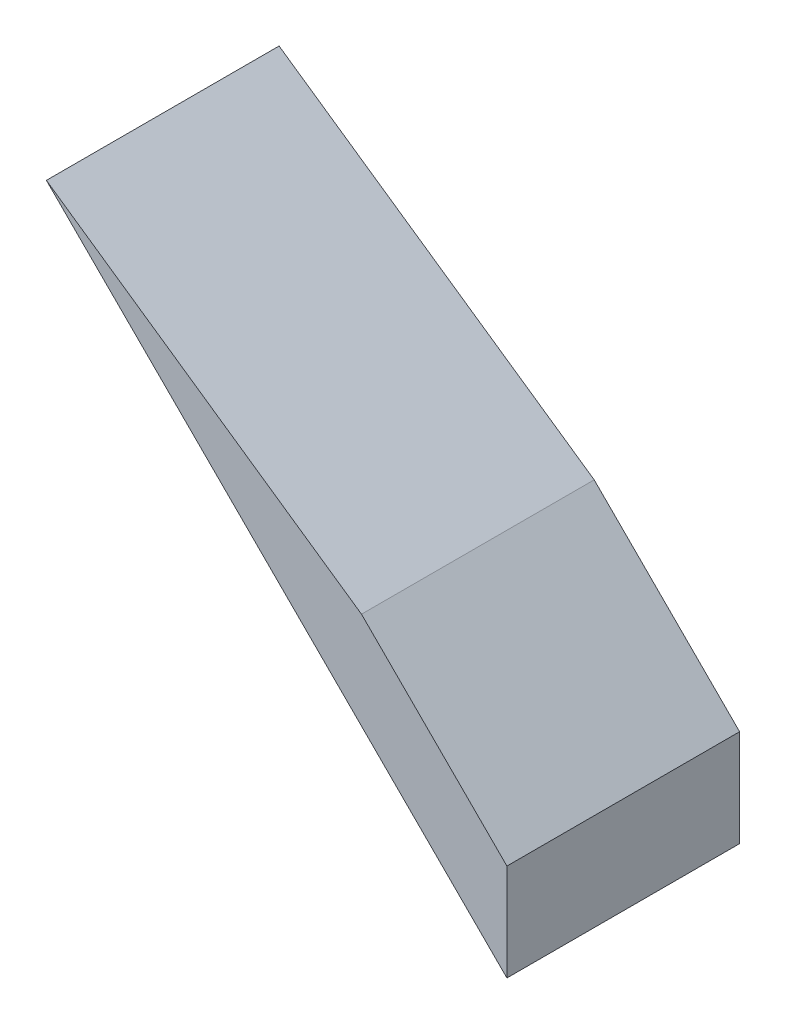
ISO-10303-21;
HEADER;
FILE_DESCRIPTION(('STEP AP214'),'2;1');
FILE_NAME('part.step','',(''),(''),'','','');
FILE_SCHEMA(('AUTOMOTIVE_DESIGN { 1 0 10303 214 1 1 1 1 }'));
ENDSEC;
DATA;
#1=APPLICATION_CONTEXT('core data for automotive mechanical design processes');
#2=APPLICATION_PROTOCOL_DEFINITION('international standard','automotive_design',2000,#1);
#3=PRODUCT_CONTEXT('',#1,'mechanical');
#4=PRODUCT('Part','Part','',(#3));
#5=PRODUCT_RELATED_PRODUCT_CATEGORY('part','',(#4));
#6=PRODUCT_DEFINITION_FORMATION('','',#4);
#7=PRODUCT_DEFINITION_CONTEXT('part definition',#1,'design');
#8=PRODUCT_DEFINITION('design','',#6,#7);
#9=PRODUCT_DEFINITION_SHAPE('','',#8);
#10=(LENGTH_UNIT() NAMED_UNIT(*) SI_UNIT(.MILLI.,.METRE.));
#11=(NAMED_UNIT(*) PLANE_ANGLE_UNIT() SI_UNIT($,.RADIAN.));
#12=(NAMED_UNIT(*) SI_UNIT($,.STERADIAN.) SOLID_ANGLE_UNIT());
#13=UNCERTAINTY_MEASURE_WITH_UNIT(LENGTH_MEASURE(1.E-05),#10,'distance_accuracy_value','');
#14=(GEOMETRIC_REPRESENTATION_CONTEXT(3) GLOBAL_UNCERTAINTY_ASSIGNED_CONTEXT((#13)) GLOBAL_UNIT_ASSIGNED_CONTEXT((#10,
#11,#12)) REPRESENTATION_CONTEXT('',''));
#15=CARTESIAN_POINT('',(0.,0.,0.));
#16=DIRECTION('',(0.,0.,1.));
#17=DIRECTION('',(1.,0.,0.));
#18=AXIS2_PLACEMENT_3D('',#15,#16,#17);
#19=CARTESIAN_POINT('',(0.2778125,0.03968749999999,0.));
#20=DIRECTION('',(0.707106781186548,0.707106781186548,0.));
#21=DIRECTION('',(-0.707106781186548,0.707106781186548,0.));
#22=AXIS2_PLACEMENT_3D('',#19,#20,#21);
#23=PLANE('',#22);
#24=DIRECTION('',(0.,0.,-1.));
#25=VECTOR('',#24,1.);
#26=CARTESIAN_POINT('',(0.7540625,-0.4365625,0.));
#27=LINE('',#26,#25);
#28=CARTESIAN_POINT('',(0.754062499999999,-0.436562500000001,0.));
#29=VERTEX_POINT('',#28);
#30=CARTESIAN_POINT('',(0.754062499999999,-0.436562500000001,0.762));
#31=VERTEX_POINT('',#30);
#32=EDGE_CURVE('E20',#29,#31,#27,.F.);
#33=ORIENTED_EDGE('',*,*,#32,.F.);
#34=DIRECTION('',(-0.707106781186555,0.70710678118654,0.));
#35=VECTOR('',#34,1.);
#36=CARTESIAN_POINT('',(0.7540625,-0.4365625,0.));
#37=LINE('',#36,#35);
#38=CARTESIAN_POINT('',(0.277812500000136,0.0396875000001907,0.));
#39=VERTEX_POINT('',#38);
#40=EDGE_CURVE('E81',#29,#39,#37,.T.);
#41=ORIENTED_EDGE('',*,*,#40,.T.);
#42=DIRECTION('',(0.,0.,1.));
#43=VECTOR('',#42,1.);
#44=CARTESIAN_POINT('',(0.277812500000276,0.0396875000003882,0.));
#45=LINE('',#44,#43);
#46=CARTESIAN_POINT('',(0.277812500000065,0.0396875000000928,0.762));
#47=VERTEX_POINT('',#46);
#48=EDGE_CURVE('E68',#47,#39,#45,.F.);
#49=ORIENTED_EDGE('',*,*,#48,.F.);
#50=DIRECTION('',(-0.707106781186555,0.70710678118654,0.));
#51=VECTOR('',#50,1.);
#52=CARTESIAN_POINT('',(0.7540625,-0.4365625,0.762));
#53=LINE('',#52,#51);
#54=EDGE_CURVE('E55',#31,#47,#53,.T.);
#55=ORIENTED_EDGE('',*,*,#54,.F.);
#56=EDGE_LOOP('',(#33,#41,#49,#55));
#57=FACE_BOUND('',#56,.T.);
#58=ADVANCED_FACE('F17',(#57),#23,.T.);
#59=CARTESIAN_POINT('',(0.7540625,-0.4365625,0.));
#60=DIRECTION('',(1.,0.,0.));
#61=DIRECTION('',(0.,0.,-1.));
#62=AXIS2_PLACEMENT_3D('',#59,#60,#61);
#63=PLANE('',#62);
#64=DIRECTION('',(0.,0.,1.));
#65=VECTOR('',#64,1.);
#66=CARTESIAN_POINT('',(0.7540625,-0.7540625,0.));
#67=LINE('',#66,#65);
#68=CARTESIAN_POINT('',(0.7540625,-0.7540625,0.));
#69=VERTEX_POINT('',#68);
#70=CARTESIAN_POINT('',(0.7540625,-0.7540625,0.762));
#71=VERTEX_POINT('',#70);
#72=EDGE_CURVE('E83',#69,#71,#67,.T.);
#73=ORIENTED_EDGE('',*,*,#72,.F.);
#74=DIRECTION('',(0.,1.,0.));
#75=VECTOR('',#74,1.);
#76=CARTESIAN_POINT('',(0.7540625,0.03968749999999,0.));
#77=LINE('',#76,#75);
#78=EDGE_CURVE('E64',#69,#29,#77,.T.);
#79=ORIENTED_EDGE('',*,*,#78,.T.);
#80=ORIENTED_EDGE('',*,*,#32,.T.);
#81=DIRECTION('',(0.,1.,0.));
#82=VECTOR('',#81,1.);
#83=CARTESIAN_POINT('',(0.7540625,0.03968749999999,0.762));
#84=LINE('',#83,#82);
#85=EDGE_CURVE('E61',#71,#31,#84,.T.);
#86=ORIENTED_EDGE('',*,*,#85,.F.);
#87=EDGE_LOOP('',(#73,#79,#80,#86));
#88=FACE_BOUND('',#87,.T.);
#89=ADVANCED_FACE('F60',(#88),#63,.T.);
#90=CARTESIAN_POINT('',(0.2778125,0.03968749999999,0.762));
#91=DIRECTION('',(0.,0.,1.));
#92=DIRECTION('',(1.,0.,0.));
#93=AXIS2_PLACEMENT_3D('',#90,#91,#92);
#94=PLANE('',#93);
#95=ORIENTED_EDGE('',*,*,#85,.T.);
#96=ORIENTED_EDGE('',*,*,#54,.T.);
#97=DIRECTION('',(-0.822192191643995,0.569209978829996,0.));
#98=VECTOR('',#97,1.);
#99=CARTESIAN_POINT('',(-0.7540625,0.7540625,0.762));
#100=LINE('',#99,#98);
#101=CARTESIAN_POINT('',(-0.754062499999998,0.754062499999999,0.762));
#102=VERTEX_POINT('',#101);
#103=EDGE_CURVE('E70',#102,#47,#100,.F.);
#104=ORIENTED_EDGE('',*,*,#103,.F.);
#105=DIRECTION('',(0.707106781186548,-0.707106781186548,0.));
#106=VECTOR('',#105,1.);
#107=CARTESIAN_POINT('',(0.7540625,-0.7540625,0.762));
#108=LINE('',#107,#106);
#109=EDGE_CURVE('E74',#71,#102,#108,.F.);
#110=ORIENTED_EDGE('',*,*,#109,.F.);
#111=EDGE_LOOP('',(#95,#96,#104,#110));
#112=FACE_BOUND('',#111,.T.);
#113=ADVANCED_FACE('F72',(#112),#94,.T.);
#114=CARTESIAN_POINT('',(-0.7540625,0.7540625,0.));
#115=DIRECTION('',(0.569209978829996,0.822192191643995,0.));
#116=DIRECTION('',(-0.822192191643995,0.569209978829996,0.));
#117=AXIS2_PLACEMENT_3D('',#114,#115,#116);
#118=PLANE('',#117);
#119=ORIENTED_EDGE('',*,*,#48,.T.);
#120=DIRECTION('',(-0.822192191643775,0.569209978830314,0.));
#121=VECTOR('',#120,1.);
#122=CARTESIAN_POINT('',(0.2778125,0.03968749999999,0.));
#123=LINE('',#122,#121);
#124=CARTESIAN_POINT('',(-0.754062499999999,0.754062499999999,0.));
#125=VERTEX_POINT('',#124);
#126=EDGE_CURVE('E35',#39,#125,#123,.T.);
#127=ORIENTED_EDGE('',*,*,#126,.T.);
#128=DIRECTION('',(0.,0.,1.));
#129=VECTOR('',#128,1.);
#130=CARTESIAN_POINT('',(-0.7540625,0.7540625,0.));
#131=LINE('',#130,#129);
#132=EDGE_CURVE('E26',#102,#125,#131,.F.);
#133=ORIENTED_EDGE('',*,*,#132,.F.);
#134=ORIENTED_EDGE('',*,*,#103,.T.);
#135=EDGE_LOOP('',(#119,#127,#133,#134));
#136=FACE_BOUND('',#135,.T.);
#137=ADVANCED_FACE('F89',(#136),#118,.T.);
#138=CARTESIAN_POINT('',(0.2778125,0.03968749999999,0.));
#139=DIRECTION('',(0.,0.,1.));
#140=DIRECTION('',(1.,0.,0.));
#141=AXIS2_PLACEMENT_3D('',#138,#139,#140);
#142=PLANE('',#141);
#143=ORIENTED_EDGE('',*,*,#78,.F.);
#144=DIRECTION('',(0.707106781186548,-0.707106781186548,0.));
#145=VECTOR('',#144,1.);
#146=CARTESIAN_POINT('',(0.7540625,-0.7540625,0.));
#147=LINE('',#146,#145);
#148=EDGE_CURVE('E11',#125,#69,#147,.T.);
#149=ORIENTED_EDGE('',*,*,#148,.F.);
#150=ORIENTED_EDGE('',*,*,#126,.F.);
#151=ORIENTED_EDGE('',*,*,#40,.F.);
#152=EDGE_LOOP('',(#143,#149,#150,#151));
#153=FACE_BOUND('',#152,.T.);
#154=ADVANCED_FACE('F91',(#153),#142,.F.);
#155=CARTESIAN_POINT('',(0.7540625,-0.7540625,0.));
#156=DIRECTION('',(-0.707106781186548,-0.707106781186548,0.));
#157=DIRECTION('',(0.707106781186548,-0.707106781186548,0.));
#158=AXIS2_PLACEMENT_3D('',#155,#156,#157);
#159=PLANE('',#158);
#160=ORIENTED_EDGE('',*,*,#132,.T.);
#161=ORIENTED_EDGE('',*,*,#148,.T.);
#162=ORIENTED_EDGE('',*,*,#72,.T.);
#163=ORIENTED_EDGE('',*,*,#109,.T.);
#164=EDGE_LOOP('',(#160,#161,#162,#163));
#165=FACE_BOUND('',#164,.T.);
#166=ADVANCED_FACE('F88',(#165),#159,.T.);
#167=CLOSED_SHELL('',(#58,#89,#113,#137,#154,#166));
#168=MANIFOLD_SOLID_BREP('B1',#167);
#169=ADVANCED_BREP_SHAPE_REPRESENTATION('',(#18,#168),#14);
#170=SHAPE_DEFINITION_REPRESENTATION(#9,#169);
ENDSEC;
END-ISO-10303-21;
